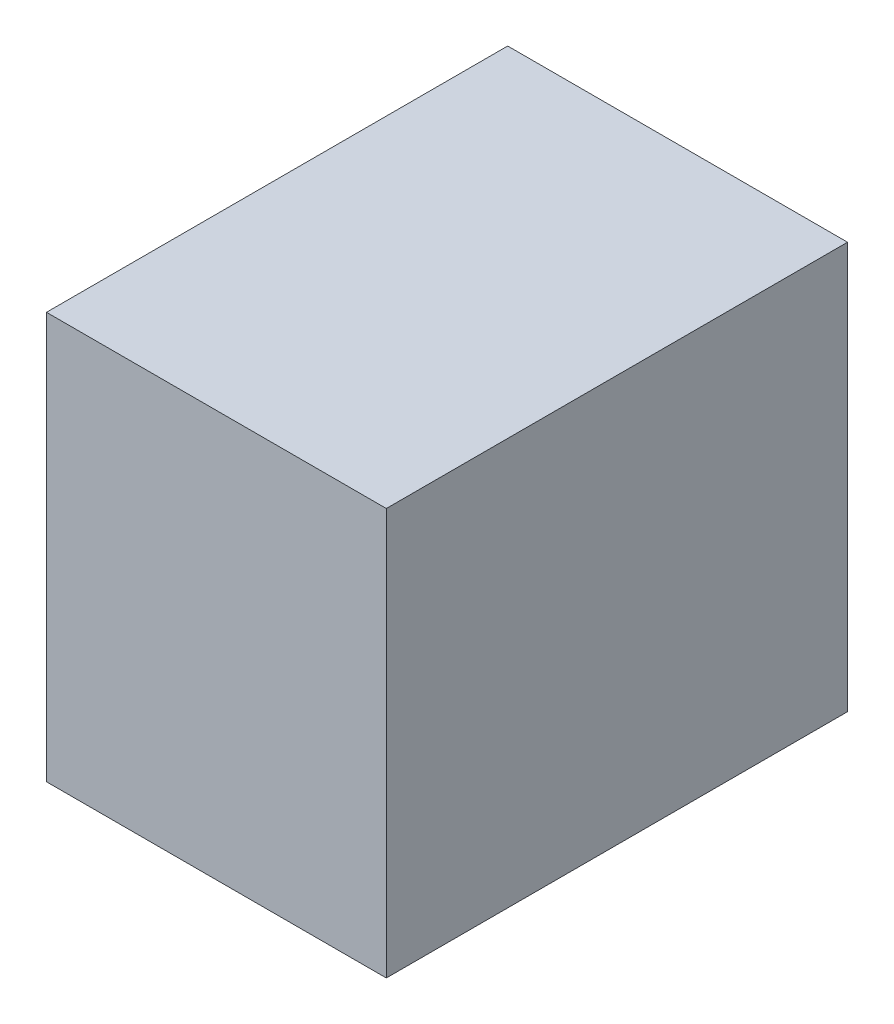
ISO-10303-21;
HEADER;
FILE_DESCRIPTION(('STEP AP214'),'2;1');
FILE_NAME('part.step','',(''),(''),'','','');
FILE_SCHEMA(('AUTOMOTIVE_DESIGN { 1 0 10303 214 1 1 1 1 }'));
ENDSEC;
DATA;
#1=APPLICATION_CONTEXT('core data for automotive mechanical design processes');
#2=APPLICATION_PROTOCOL_DEFINITION('international standard','automotive_design',2000,#1);
#3=PRODUCT_CONTEXT('',#1,'mechanical');
#4=PRODUCT('Part','Part','',(#3));
#5=PRODUCT_RELATED_PRODUCT_CATEGORY('part','',(#4));
#6=PRODUCT_DEFINITION_FORMATION('','',#4);
#7=PRODUCT_DEFINITION_CONTEXT('part definition',#1,'design');
#8=PRODUCT_DEFINITION('design','',#6,#7);
#9=PRODUCT_DEFINITION_SHAPE('','',#8);
#10=(LENGTH_UNIT() NAMED_UNIT(*) SI_UNIT(.MILLI.,.METRE.));
#11=(NAMED_UNIT(*) PLANE_ANGLE_UNIT() SI_UNIT($,.RADIAN.));
#12=(NAMED_UNIT(*) SI_UNIT($,.STERADIAN.) SOLID_ANGLE_UNIT());
#13=UNCERTAINTY_MEASURE_WITH_UNIT(LENGTH_MEASURE(1.E-05),#10,'distance_accuracy_value','');
#14=(GEOMETRIC_REPRESENTATION_CONTEXT(3) GLOBAL_UNCERTAINTY_ASSIGNED_CONTEXT((#13)) GLOBAL_UNIT_ASSIGNED_CONTEXT((#10,
#11,#12)) REPRESENTATION_CONTEXT('',''));
#15=CARTESIAN_POINT('',(0.,0.,0.));
#16=DIRECTION('',(0.,0.,1.));
#17=DIRECTION('',(1.,0.,0.));
#18=AXIS2_PLACEMENT_3D('',#15,#16,#17);
#19=CARTESIAN_POINT('',(0.,67.,0.));
#20=DIRECTION('',(1.,0.,0.));
#21=DIRECTION('',(0.,0.,-1.));
#22=AXIS2_PLACEMENT_3D('',#19,#20,#21);
#23=PLANE('',#22);
#24=DIRECTION('',(0.,0.,1.));
#25=VECTOR('',#24,1.);
#26=CARTESIAN_POINT('',(0.,0.,0.));
#27=LINE('',#26,#25);
#28=CARTESIAN_POINT('',(0.,0.,0.));
#29=VERTEX_POINT('',#28);
#30=CARTESIAN_POINT('',(0.,0.,76.));
#31=VERTEX_POINT('',#30);
#32=EDGE_CURVE('E111',#29,#31,#27,.T.);
#33=ORIENTED_EDGE('',*,*,#32,.T.);
#34=DIRECTION('',(0.,-1.,0.));
#35=VECTOR('',#34,1.);
#36=CARTESIAN_POINT('',(0.,67.,76.));
#37=LINE('',#36,#35);
#38=CARTESIAN_POINT('',(0.,67.,76.));
#39=VERTEX_POINT('',#38);
#40=EDGE_CURVE('E11',#39,#31,#37,.T.);
#41=ORIENTED_EDGE('',*,*,#40,.F.);
#42=DIRECTION('',(0.,0.,1.));
#43=VECTOR('',#42,1.);
#44=CARTESIAN_POINT('',(0.,67.,0.));
#45=LINE('',#44,#43);
#46=CARTESIAN_POINT('',(0.,67.,0.));
#47=VERTEX_POINT('',#46);
#48=EDGE_CURVE('E95',#47,#39,#45,.T.);
#49=ORIENTED_EDGE('',*,*,#48,.F.);
#50=DIRECTION('',(0.,-1.,0.));
#51=VECTOR('',#50,1.);
#52=CARTESIAN_POINT('',(0.,67.,0.));
#53=LINE('',#52,#51);
#54=EDGE_CURVE('E107',#47,#29,#53,.T.);
#55=ORIENTED_EDGE('',*,*,#54,.T.);
#56=EDGE_LOOP('',(#33,#41,#49,#55));
#57=FACE_BOUND('',#56,.T.);
#58=ADVANCED_FACE('F43',(#57),#23,.F.);
#59=CARTESIAN_POINT('',(0.,67.,76.));
#60=DIRECTION('',(0.,0.,-1.));
#61=DIRECTION('',(-1.,0.,0.));
#62=AXIS2_PLACEMENT_3D('',#59,#60,#61);
#63=PLANE('',#62);
#64=DIRECTION('',(1.,0.,0.));
#65=VECTOR('',#64,1.);
#66=CARTESIAN_POINT('',(0.,0.,76.));
#67=LINE('',#66,#65);
#68=CARTESIAN_POINT('',(56.,0.,76.));
#69=VERTEX_POINT('',#68);
#70=EDGE_CURVE('E100',#31,#69,#67,.T.);
#71=ORIENTED_EDGE('',*,*,#70,.T.);
#72=DIRECTION('',(0.,-1.,0.));
#73=VECTOR('',#72,1.);
#74=CARTESIAN_POINT('',(56.,67.,76.));
#75=LINE('',#74,#73);
#76=CARTESIAN_POINT('',(56.,67.,76.));
#77=VERTEX_POINT('',#76);
#78=EDGE_CURVE('E52',#77,#69,#75,.T.);
#79=ORIENTED_EDGE('',*,*,#78,.F.);
#80=DIRECTION('',(1.,0.,0.));
#81=VECTOR('',#80,1.);
#82=CARTESIAN_POINT('',(0.,67.,76.));
#83=LINE('',#82,#81);
#84=EDGE_CURVE('E90',#39,#77,#83,.T.);
#85=ORIENTED_EDGE('',*,*,#84,.F.);
#86=ORIENTED_EDGE('',*,*,#40,.T.);
#87=EDGE_LOOP('',(#71,#79,#85,#86));
#88=FACE_BOUND('',#87,.T.);
#89=ADVANCED_FACE('F99',(#88),#63,.F.);
#90=CARTESIAN_POINT('',(56.,67.,0.));
#91=DIRECTION('',(-1.,0.,0.));
#92=DIRECTION('',(0.,0.,1.));
#93=AXIS2_PLACEMENT_3D('',#90,#91,#92);
#94=PLANE('',#93);
#95=DIRECTION('',(0.,0.,-1.));
#96=VECTOR('',#95,1.);
#97=CARTESIAN_POINT('',(56.,0.,0.));
#98=LINE('',#97,#96);
#99=CARTESIAN_POINT('',(56.,0.,0.));
#100=VERTEX_POINT('',#99);
#101=EDGE_CURVE('E77',#69,#100,#98,.T.);
#102=ORIENTED_EDGE('',*,*,#101,.T.);
#103=DIRECTION('',(0.,-1.,0.));
#104=VECTOR('',#103,1.);
#105=CARTESIAN_POINT('',(56.,67.,0.));
#106=LINE('',#105,#104);
#107=CARTESIAN_POINT('',(56.,67.,0.));
#108=VERTEX_POINT('',#107);
#109=EDGE_CURVE('E102',#108,#100,#106,.T.);
#110=ORIENTED_EDGE('',*,*,#109,.F.);
#111=DIRECTION('',(0.,0.,-1.));
#112=VECTOR('',#111,1.);
#113=CARTESIAN_POINT('',(56.,67.,0.));
#114=LINE('',#113,#112);
#115=EDGE_CURVE('E93',#77,#108,#114,.T.);
#116=ORIENTED_EDGE('',*,*,#115,.F.);
#117=ORIENTED_EDGE('',*,*,#78,.T.);
#118=EDGE_LOOP('',(#102,#110,#116,#117));
#119=FACE_BOUND('',#118,.T.);
#120=ADVANCED_FACE('F103',(#119),#94,.F.);
#121=CARTESIAN_POINT('',(0.,67.,0.));
#122=DIRECTION('',(0.,0.,1.));
#123=DIRECTION('',(1.,0.,0.));
#124=AXIS2_PLACEMENT_3D('',#121,#122,#123);
#125=PLANE('',#124);
#126=DIRECTION('',(-1.,0.,0.));
#127=VECTOR('',#126,1.);
#128=CARTESIAN_POINT('',(0.,0.,0.));
#129=LINE('',#128,#127);
#130=EDGE_CURVE('E83',#100,#29,#129,.T.);
#131=ORIENTED_EDGE('',*,*,#130,.T.);
#132=ORIENTED_EDGE('',*,*,#54,.F.);
#133=DIRECTION('',(-1.,0.,0.));
#134=VECTOR('',#133,1.);
#135=CARTESIAN_POINT('',(0.,67.,0.));
#136=LINE('',#135,#134);
#137=EDGE_CURVE('E60',#108,#47,#136,.T.);
#138=ORIENTED_EDGE('',*,*,#137,.F.);
#139=ORIENTED_EDGE('',*,*,#109,.T.);
#140=EDGE_LOOP('',(#131,#132,#138,#139));
#141=FACE_BOUND('',#140,.T.);
#142=ADVANCED_FACE('F124',(#141),#125,.F.);
#143=CARTESIAN_POINT('',(0.,67.,0.));
#144=DIRECTION('',(0.,1.,0.));
#145=DIRECTION('',(0.,0.,1.));
#146=AXIS2_PLACEMENT_3D('',#143,#144,#145);
#147=PLANE('',#146);
#148=ORIENTED_EDGE('',*,*,#48,.T.);
#149=ORIENTED_EDGE('',*,*,#84,.T.);
#150=ORIENTED_EDGE('',*,*,#115,.T.);
#151=ORIENTED_EDGE('',*,*,#137,.T.);
#152=EDGE_LOOP('',(#148,#149,#150,#151));
#153=FACE_BOUND('',#152,.T.);
#154=ADVANCED_FACE('F91',(#153),#147,.T.);
#155=CARTESIAN_POINT('',(0.,0.,0.));
#156=DIRECTION('',(0.,1.,0.));
#157=DIRECTION('',(0.,0.,1.));
#158=AXIS2_PLACEMENT_3D('',#155,#156,#157);
#159=PLANE('',#158);
#160=ORIENTED_EDGE('',*,*,#32,.F.);
#161=ORIENTED_EDGE('',*,*,#130,.F.);
#162=ORIENTED_EDGE('',*,*,#101,.F.);
#163=ORIENTED_EDGE('',*,*,#70,.F.);
#164=EDGE_LOOP('',(#160,#161,#162,#163));
#165=FACE_BOUND('',#164,.T.);
#166=ADVANCED_FACE('F127',(#165),#159,.F.);
#167=CLOSED_SHELL('',(#58,#89,#120,#142,#154,#166));
#168=MANIFOLD_SOLID_BREP('B2',#167);
#169=ADVANCED_BREP_SHAPE_REPRESENTATION('',(#18,#168),#14);
#170=SHAPE_DEFINITION_REPRESENTATION(#9,#169);
ENDSEC;
END-ISO-10303-21;
